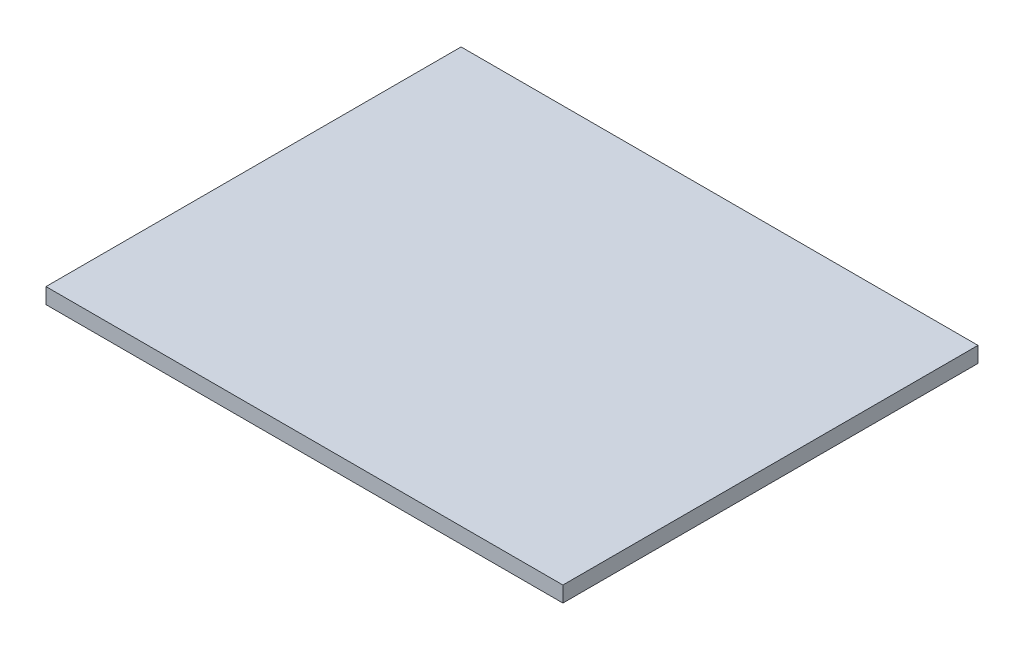
ISO-10303-21;
HEADER;
FILE_DESCRIPTION(('STEP AP214'),'2;1');
FILE_NAME('part.step','',(''),(''),'','','');
FILE_SCHEMA(('AUTOMOTIVE_DESIGN { 1 0 10303 214 1 1 1 1 }'));
ENDSEC;
DATA;
#1=APPLICATION_CONTEXT('core data for automotive mechanical design processes');
#2=APPLICATION_PROTOCOL_DEFINITION('international standard','automotive_design',2000,#1);
#3=PRODUCT_CONTEXT('',#1,'mechanical');
#4=PRODUCT('Part','Part','',(#3));
#5=PRODUCT_RELATED_PRODUCT_CATEGORY('part','',(#4));
#6=PRODUCT_DEFINITION_FORMATION('','',#4);
#7=PRODUCT_DEFINITION_CONTEXT('part definition',#1,'design');
#8=PRODUCT_DEFINITION('design','',#6,#7);
#9=PRODUCT_DEFINITION_SHAPE('','',#8);
#10=(LENGTH_UNIT() NAMED_UNIT(*) SI_UNIT(.MILLI.,.METRE.));
#11=(NAMED_UNIT(*) PLANE_ANGLE_UNIT() SI_UNIT($,.RADIAN.));
#12=(NAMED_UNIT(*) SI_UNIT($,.STERADIAN.) SOLID_ANGLE_UNIT());
#13=UNCERTAINTY_MEASURE_WITH_UNIT(LENGTH_MEASURE(1.E-05),#10,'distance_accuracy_value','');
#14=(GEOMETRIC_REPRESENTATION_CONTEXT(3) GLOBAL_UNCERTAINTY_ASSIGNED_CONTEXT((#13)) GLOBAL_UNIT_ASSIGNED_CONTEXT((#10,
#11,#12)) REPRESENTATION_CONTEXT('',''));
#15=CARTESIAN_POINT('',(0.,0.,0.));
#16=DIRECTION('',(0.,0.,1.));
#17=DIRECTION('',(1.,0.,0.));
#18=AXIS2_PLACEMENT_3D('',#15,#16,#17);
#19=CARTESIAN_POINT('',(0.,0.,53.));
#20=DIRECTION('',(1.,0.,0.));
#21=DIRECTION('',(0.,0.,-1.));
#22=AXIS2_PLACEMENT_3D('',#19,#20,#21);
#23=PLANE('',#22);
#24=DIRECTION('',(0.,-1.,0.));
#25=VECTOR('',#24,1.);
#26=CARTESIAN_POINT('',(0.,0.,0.));
#27=LINE('',#26,#25);
#28=CARTESIAN_POINT('',(0.,2.,0.));
#29=VERTEX_POINT('',#28);
#30=CARTESIAN_POINT('',(0.,0.,0.));
#31=VERTEX_POINT('',#30);
#32=EDGE_CURVE('E105',#29,#31,#27,.T.);
#33=ORIENTED_EDGE('',*,*,#32,.T.);
#34=DIRECTION('',(0.,0.,-1.));
#35=VECTOR('',#34,1.);
#36=CARTESIAN_POINT('',(0.,0.,53.));
#37=LINE('',#36,#35);
#38=CARTESIAN_POINT('',(0.,0.,53.));
#39=VERTEX_POINT('',#38);
#40=EDGE_CURVE('E11',#39,#31,#37,.T.);
#41=ORIENTED_EDGE('',*,*,#40,.F.);
#42=DIRECTION('',(0.,-1.,0.));
#43=VECTOR('',#42,1.);
#44=CARTESIAN_POINT('',(0.,0.,53.));
#45=LINE('',#44,#43);
#46=CARTESIAN_POINT('',(0.,2.,53.));
#47=VERTEX_POINT('',#46);
#48=EDGE_CURVE('E89',#47,#39,#45,.T.);
#49=ORIENTED_EDGE('',*,*,#48,.F.);
#50=DIRECTION('',(0.,0.,-1.));
#51=VECTOR('',#50,1.);
#52=CARTESIAN_POINT('',(0.,2.,53.));
#53=LINE('',#52,#51);
#54=EDGE_CURVE('E98',#47,#29,#53,.T.);
#55=ORIENTED_EDGE('',*,*,#54,.T.);
#56=EDGE_LOOP('',(#33,#41,#49,#55));
#57=FACE_BOUND('',#56,.T.);
#58=ADVANCED_FACE('F39',(#57),#23,.F.);
#59=CARTESIAN_POINT('',(0.,0.,53.));
#60=DIRECTION('',(0.,1.,0.));
#61=DIRECTION('',(0.,0.,1.));
#62=AXIS2_PLACEMENT_3D('',#59,#60,#61);
#63=PLANE('',#62);
#64=DIRECTION('',(1.,0.,0.));
#65=VECTOR('',#64,1.);
#66=CARTESIAN_POINT('',(0.,0.,0.));
#67=LINE('',#66,#65);
#68=CARTESIAN_POINT('',(66.,0.,0.));
#69=VERTEX_POINT('',#68);
#70=EDGE_CURVE('E94',#31,#69,#67,.T.);
#71=ORIENTED_EDGE('',*,*,#70,.T.);
#72=DIRECTION('',(0.,0.,-1.));
#73=VECTOR('',#72,1.);
#74=CARTESIAN_POINT('',(66.,0.,53.));
#75=LINE('',#74,#73);
#76=CARTESIAN_POINT('',(66.,0.,53.));
#77=VERTEX_POINT('',#76);
#78=EDGE_CURVE('E50',#77,#69,#75,.T.);
#79=ORIENTED_EDGE('',*,*,#78,.F.);
#80=DIRECTION('',(1.,0.,0.));
#81=VECTOR('',#80,1.);
#82=CARTESIAN_POINT('',(0.,0.,53.));
#83=LINE('',#82,#81);
#84=EDGE_CURVE('E84',#39,#77,#83,.T.);
#85=ORIENTED_EDGE('',*,*,#84,.F.);
#86=ORIENTED_EDGE('',*,*,#40,.T.);
#87=EDGE_LOOP('',(#71,#79,#85,#86));
#88=FACE_BOUND('',#87,.T.);
#89=ADVANCED_FACE('F91',(#88),#63,.F.);
#90=CARTESIAN_POINT('',(66.,0.,53.));
#91=DIRECTION('',(-1.,0.,0.));
#92=DIRECTION('',(0.,0.,1.));
#93=AXIS2_PLACEMENT_3D('',#90,#91,#92);
#94=PLANE('',#93);
#95=DIRECTION('',(0.,1.,0.));
#96=VECTOR('',#95,1.);
#97=CARTESIAN_POINT('',(66.,0.,0.));
#98=LINE('',#97,#96);
#99=CARTESIAN_POINT('',(66.,2.,0.));
#100=VERTEX_POINT('',#99);
#101=EDGE_CURVE('E75',#69,#100,#98,.T.);
#102=ORIENTED_EDGE('',*,*,#101,.T.);
#103=DIRECTION('',(0.,0.,-1.));
#104=VECTOR('',#103,1.);
#105=CARTESIAN_POINT('',(66.,2.,53.));
#106=LINE('',#105,#104);
#107=CARTESIAN_POINT('',(66.,2.,53.));
#108=VERTEX_POINT('',#107);
#109=EDGE_CURVE('E92',#108,#100,#106,.T.);
#110=ORIENTED_EDGE('',*,*,#109,.F.);
#111=DIRECTION('',(0.,1.,0.));
#112=VECTOR('',#111,1.);
#113=CARTESIAN_POINT('',(66.,0.,53.));
#114=LINE('',#113,#112);
#115=EDGE_CURVE('E86',#77,#108,#114,.T.);
#116=ORIENTED_EDGE('',*,*,#115,.F.);
#117=ORIENTED_EDGE('',*,*,#78,.T.);
#118=EDGE_LOOP('',(#102,#110,#116,#117));
#119=FACE_BOUND('',#118,.T.);
#120=ADVANCED_FACE('F96',(#119),#94,.F.);
#121=CARTESIAN_POINT('',(0.,2.,53.));
#122=DIRECTION('',(0.,-1.,0.));
#123=DIRECTION('',(0.,0.,-1.));
#124=AXIS2_PLACEMENT_3D('',#121,#122,#123);
#125=PLANE('',#124);
#126=DIRECTION('',(-1.,0.,0.));
#127=VECTOR('',#126,1.);
#128=CARTESIAN_POINT('',(0.,2.,0.));
#129=LINE('',#128,#127);
#130=EDGE_CURVE('E79',#100,#29,#129,.T.);
#131=ORIENTED_EDGE('',*,*,#130,.T.);
#132=ORIENTED_EDGE('',*,*,#54,.F.);
#133=DIRECTION('',(-1.,0.,0.));
#134=VECTOR('',#133,1.);
#135=CARTESIAN_POINT('',(0.,2.,53.));
#136=LINE('',#135,#134);
#137=EDGE_CURVE('E54',#108,#47,#136,.T.);
#138=ORIENTED_EDGE('',*,*,#137,.F.);
#139=ORIENTED_EDGE('',*,*,#109,.T.);
#140=EDGE_LOOP('',(#131,#132,#138,#139));
#141=FACE_BOUND('',#140,.T.);
#142=ADVANCED_FACE('F108',(#141),#125,.F.);
#143=CARTESIAN_POINT('',(0.,0.,53.));
#144=DIRECTION('',(0.,0.,-1.));
#145=DIRECTION('',(-1.,0.,0.));
#146=AXIS2_PLACEMENT_3D('',#143,#144,#145);
#147=PLANE('',#146);
#148=ORIENTED_EDGE('',*,*,#48,.T.);
#149=ORIENTED_EDGE('',*,*,#84,.T.);
#150=ORIENTED_EDGE('',*,*,#115,.T.);
#151=ORIENTED_EDGE('',*,*,#137,.T.);
#152=EDGE_LOOP('',(#148,#149,#150,#151));
#153=FACE_BOUND('',#152,.T.);
#154=ADVANCED_FACE('F88',(#153),#147,.F.);
#155=CARTESIAN_POINT('',(0.,0.,0.));
#156=DIRECTION('',(0.,0.,-1.));
#157=DIRECTION('',(-1.,0.,0.));
#158=AXIS2_PLACEMENT_3D('',#155,#156,#157);
#159=PLANE('',#158);
#160=ORIENTED_EDGE('',*,*,#32,.F.);
#161=ORIENTED_EDGE('',*,*,#130,.F.);
#162=ORIENTED_EDGE('',*,*,#101,.F.);
#163=ORIENTED_EDGE('',*,*,#70,.F.);
#164=EDGE_LOOP('',(#160,#161,#162,#163));
#165=FACE_BOUND('',#164,.T.);
#166=ADVANCED_FACE('F115',(#165),#159,.T.);
#167=CLOSED_SHELL('',(#58,#89,#120,#142,#154,#166));
#168=MANIFOLD_SOLID_BREP('B2',#167);
#169=ADVANCED_BREP_SHAPE_REPRESENTATION('',(#18,#168),#14);
#170=SHAPE_DEFINITION_REPRESENTATION(#9,#169);
ENDSEC;
END-ISO-10303-21;
